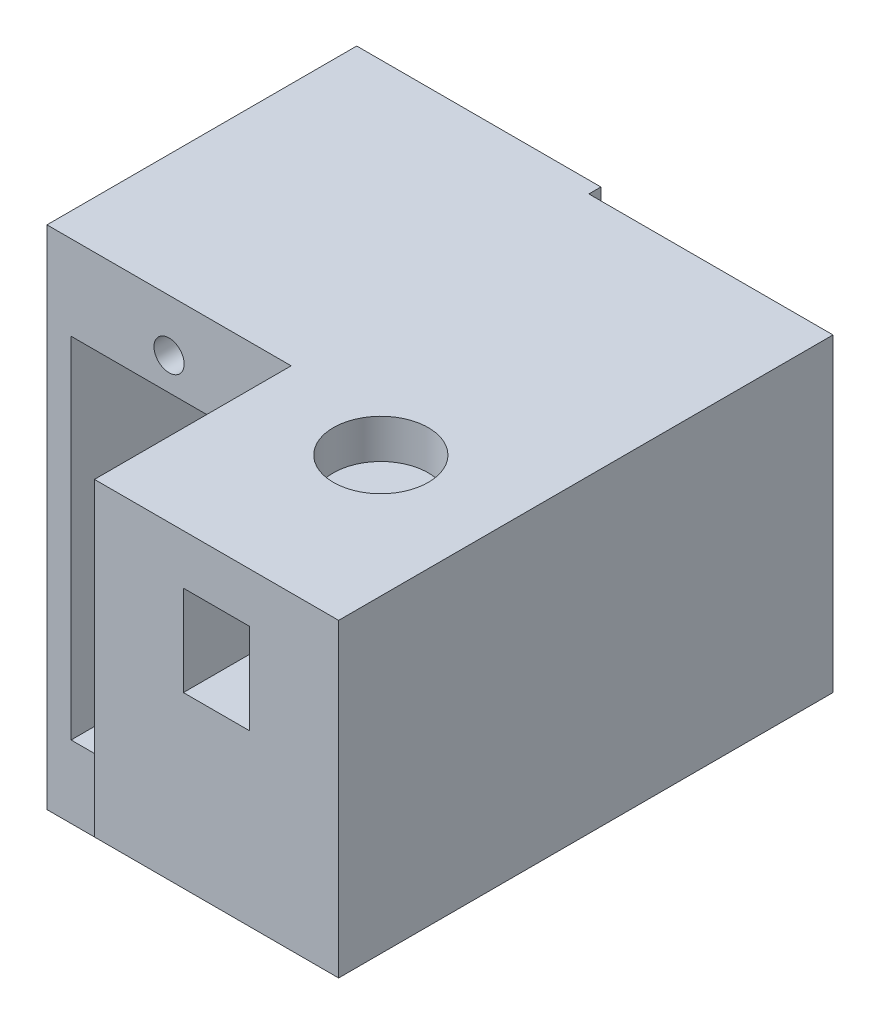
ISO-10303-21;
HEADER;
FILE_DESCRIPTION(('STEP AP214'),'2;1');
FILE_NAME('part.step','',(''),(''),'','','');
FILE_SCHEMA(('AUTOMOTIVE_DESIGN { 1 0 10303 214 1 1 1 1 }'));
ENDSEC;
DATA;
#1=APPLICATION_CONTEXT('core data for automotive mechanical design processes');
#2=APPLICATION_PROTOCOL_DEFINITION('international standard','automotive_design',2000,#1);
#3=PRODUCT_CONTEXT('',#1,'mechanical');
#4=PRODUCT('Part','Part','',(#3));
#5=PRODUCT_RELATED_PRODUCT_CATEGORY('part','',(#4));
#6=PRODUCT_DEFINITION_FORMATION('','',#4);
#7=PRODUCT_DEFINITION_CONTEXT('part definition',#1,'design');
#8=PRODUCT_DEFINITION('design','',#6,#7);
#9=PRODUCT_DEFINITION_SHAPE('','',#8);
#10=(LENGTH_UNIT() NAMED_UNIT(*) SI_UNIT(.MILLI.,.METRE.));
#11=(NAMED_UNIT(*) PLANE_ANGLE_UNIT() SI_UNIT($,.RADIAN.));
#12=(NAMED_UNIT(*) SI_UNIT($,.STERADIAN.) SOLID_ANGLE_UNIT());
#13=UNCERTAINTY_MEASURE_WITH_UNIT(LENGTH_MEASURE(1.E-05),#10,'distance_accuracy_value','');
#14=(GEOMETRIC_REPRESENTATION_CONTEXT(3) GLOBAL_UNCERTAINTY_ASSIGNED_CONTEXT((#13)) GLOBAL_UNIT_ASSIGNED_CONTEXT((#10,
#11,#12)) REPRESENTATION_CONTEXT('',''));
#15=CARTESIAN_POINT('',(0.,0.,0.));
#16=DIRECTION('',(0.,0.,1.));
#17=DIRECTION('',(1.,0.,0.));
#18=AXIS2_PLACEMENT_3D('',#15,#16,#17);
#19=CARTESIAN_POINT('',(-8.1,-6.8,10.9));
#20=DIRECTION('',(1.,0.,0.));
#21=DIRECTION('',(0.,0.,-1.));
#22=AXIS2_PLACEMENT_3D('',#19,#20,#21);
#23=PLANE('',#22);
#24=DIRECTION('',(0.,0.,1.));
#25=VECTOR('',#24,1.);
#26=CARTESIAN_POINT('',(-8.1,-6.8,10.9));
#27=LINE('',#26,#25);
#28=CARTESIAN_POINT('',(-8.1,-6.8,-2.15));
#29=VERTEX_POINT('',#28);
#30=CARTESIAN_POINT('',(-8.1,-6.8,10.9));
#31=VERTEX_POINT('',#30);
#32=EDGE_CURVE('E470',#29,#31,#27,.T.);
#33=ORIENTED_EDGE('',*,*,#32,.F.);
#34=DIRECTION('',(0.,1.,0.));
#35=VECTOR('',#34,1.);
#36=CARTESIAN_POINT('',(-8.1,-40.4,-2.15));
#37=LINE('',#36,#35);
#38=CARTESIAN_POINT('',(-8.1,-27.35,-2.15));
#39=VERTEX_POINT('',#38);
#40=EDGE_CURVE('E11',#39,#29,#37,.T.);
#41=ORIENTED_EDGE('',*,*,#40,.F.);
#42=DIRECTION('',(0.,0.,1.));
#43=VECTOR('',#42,1.);
#44=CARTESIAN_POINT('',(-8.1,-27.35,10.9));
#45=LINE('',#44,#43);
#46=CARTESIAN_POINT('',(-8.1,-27.35,10.9));
#47=VERTEX_POINT('',#46);
#48=EDGE_CURVE('E469',#39,#47,#45,.T.);
#49=ORIENTED_EDGE('',*,*,#48,.T.);
#50=DIRECTION('',(0.,-1.,0.));
#51=VECTOR('',#50,1.);
#52=CARTESIAN_POINT('',(-8.1,-6.8,10.9));
#53=LINE('',#52,#51);
#54=EDGE_CURVE('E42',#31,#47,#53,.T.);
#55=ORIENTED_EDGE('',*,*,#54,.F.);
#56=EDGE_LOOP('',(#33,#41,#49,#55));
#57=FACE_BOUND('',#56,.T.);
#58=ADVANCED_FACE('F39',(#57),#23,.F.);
#59=CARTESIAN_POINT('',(-8.1,-6.8,10.9));
#60=DIRECTION('',(0.,0.,-1.));
#61=DIRECTION('',(-1.,0.,0.));
#62=AXIS2_PLACEMENT_3D('',#59,#60,#61);
#63=PLANE('',#62);
#64=DIRECTION('',(1.,0.,0.));
#65=VECTOR('',#64,1.);
#66=CARTESIAN_POINT('',(-2.2,-16.1,10.9));
#67=LINE('',#66,#65);
#68=CARTESIAN_POINT('',(-2.2,-16.1,10.9));
#69=VERTEX_POINT('',#68);
#70=CARTESIAN_POINT('',(2.2,-16.1,10.9));
#71=VERTEX_POINT('',#70);
#72=EDGE_CURVE('E335',#69,#71,#67,.T.);
#73=ORIENTED_EDGE('',*,*,#72,.F.);
#74=DIRECTION('',(0.,-1.,0.));
#75=VECTOR('',#74,1.);
#76=CARTESIAN_POINT('',(-2.2,-16.1,10.9));
#77=LINE('',#76,#75);
#78=CARTESIAN_POINT('',(-2.2,-10.1,10.9));
#79=VERTEX_POINT('',#78);
#80=EDGE_CURVE('E310',#79,#69,#77,.T.);
#81=ORIENTED_EDGE('',*,*,#80,.F.);
#82=DIRECTION('',(-1.,0.,0.));
#83=VECTOR('',#82,1.);
#84=CARTESIAN_POINT('',(-2.2,-10.1,10.9));
#85=LINE('',#84,#83);
#86=CARTESIAN_POINT('',(2.2,-10.1,10.9));
#87=VERTEX_POINT('',#86);
#88=EDGE_CURVE('E324',#87,#79,#85,.T.);
#89=ORIENTED_EDGE('',*,*,#88,.F.);
#90=DIRECTION('',(0.,1.,0.));
#91=VECTOR('',#90,1.);
#92=CARTESIAN_POINT('',(2.2,-16.1,10.9));
#93=LINE('',#92,#91);
#94=EDGE_CURVE('E339',#71,#87,#93,.T.);
#95=ORIENTED_EDGE('',*,*,#94,.F.);
#96=EDGE_LOOP('',(#73,#81,#89,#95));
#97=FACE_BOUND('',#96,.T.);
#98=DIRECTION('',(1.,0.,0.));
#99=VECTOR('',#98,1.);
#100=CARTESIAN_POINT('',(-8.1,-27.35,10.9));
#101=LINE('',#100,#99);
#102=CARTESIAN_POINT('',(8.1,-27.35,10.9));
#103=VERTEX_POINT('',#102);
#104=EDGE_CURVE('E488',#47,#103,#101,.T.);
#105=ORIENTED_EDGE('',*,*,#104,.T.);
#106=DIRECTION('',(0.,-1.,0.));
#107=VECTOR('',#106,1.);
#108=CARTESIAN_POINT('',(8.1,-6.8,10.9));
#109=LINE('',#108,#107);
#110=CARTESIAN_POINT('',(8.1,-6.8,10.9));
#111=VERTEX_POINT('',#110);
#112=EDGE_CURVE('E502',#111,#103,#109,.T.);
#113=ORIENTED_EDGE('',*,*,#112,.F.);
#114=DIRECTION('',(1.,0.,0.));
#115=VECTOR('',#114,1.);
#116=CARTESIAN_POINT('',(-8.1,-6.8,10.9));
#117=LINE('',#116,#115);
#118=EDGE_CURVE('E473',#31,#111,#117,.T.);
#119=ORIENTED_EDGE('',*,*,#118,.F.);
#120=ORIENTED_EDGE('',*,*,#54,.T.);
#121=EDGE_LOOP('',(#105,#113,#119,#120));
#122=FACE_BOUND('',#121,.T.);
#123=ADVANCED_FACE('F514',(#97,#122),#63,.F.);
#124=CARTESIAN_POINT('',(8.1,-6.8,10.9));
#125=DIRECTION('',(-1.,0.,0.));
#126=DIRECTION('',(0.,0.,1.));
#127=AXIS2_PLACEMENT_3D('',#124,#125,#126);
#128=PLANE('',#127);
#129=DIRECTION('',(0.,0.,-1.));
#130=VECTOR('',#129,1.);
#131=CARTESIAN_POINT('',(8.1,-27.35,10.9));
#132=LINE('',#131,#130);
#133=CARTESIAN_POINT('',(8.1,-27.35,-21.9));
#134=VERTEX_POINT('',#133);
#135=EDGE_CURVE('E491',#103,#134,#132,.T.);
#136=ORIENTED_EDGE('',*,*,#135,.T.);
#137=DIRECTION('',(0.,-1.,0.));
#138=VECTOR('',#137,1.);
#139=CARTESIAN_POINT('',(8.1,-6.8,-21.9));
#140=LINE('',#139,#138);
#141=CARTESIAN_POINT('',(8.1,-6.8,-21.9));
#142=VERTEX_POINT('',#141);
#143=EDGE_CURVE('E499',#142,#134,#140,.T.);
#144=ORIENTED_EDGE('',*,*,#143,.F.);
#145=DIRECTION('',(0.,0.,-1.));
#146=VECTOR('',#145,1.);
#147=CARTESIAN_POINT('',(8.1,-6.8,10.9));
#148=LINE('',#147,#146);
#149=EDGE_CURVE('E477',#111,#142,#148,.T.);
#150=ORIENTED_EDGE('',*,*,#149,.F.);
#151=ORIENTED_EDGE('',*,*,#112,.T.);
#152=EDGE_LOOP('',(#136,#144,#150,#151));
#153=FACE_BOUND('',#152,.T.);
#154=ADVANCED_FACE('F525',(#153),#128,.F.);
#155=CARTESIAN_POINT('',(-8.1,-6.8,-21.9));
#156=DIRECTION('',(0.,0.,1.));
#157=DIRECTION('',(1.,0.,0.));
#158=AXIS2_PLACEMENT_3D('',#155,#156,#157);
#159=PLANE('',#158);
#160=DIRECTION('',(-1.,0.,0.));
#161=VECTOR('',#160,1.);
#162=CARTESIAN_POINT('',(-8.1,-27.35,-21.9));
#163=LINE('',#162,#161);
#164=CARTESIAN_POINT('',(-8.1,-27.35,-21.9));
#165=VERTEX_POINT('',#164);
#166=EDGE_CURVE('E474',#134,#165,#163,.T.);
#167=ORIENTED_EDGE('',*,*,#166,.T.);
#168=DIRECTION('',(0.,-1.,0.));
#169=VECTOR('',#168,1.);
#170=CARTESIAN_POINT('',(-8.1,-6.8,-21.9));
#171=LINE('',#170,#169);
#172=CARTESIAN_POINT('',(-8.1,-6.8,-21.9));
#173=VERTEX_POINT('',#172);
#174=EDGE_CURVE('E483',#173,#165,#171,.T.);
#175=ORIENTED_EDGE('',*,*,#174,.F.);
#176=DIRECTION('',(-1.,0.,0.));
#177=VECTOR('',#176,1.);
#178=CARTESIAN_POINT('',(-8.1,-6.8,-21.9));
#179=LINE('',#178,#177);
#180=EDGE_CURVE('E480',#142,#173,#179,.T.);
#181=ORIENTED_EDGE('',*,*,#180,.F.);
#182=ORIENTED_EDGE('',*,*,#143,.T.);
#183=EDGE_LOOP('',(#167,#175,#181,#182));
#184=FACE_BOUND('',#183,.T.);
#185=ADVANCED_FACE('F528',(#184),#159,.F.);
#186=CARTESIAN_POINT('',(0.,-6.8,0.));
#187=DIRECTION('',(0.,-1.,0.));
#188=DIRECTION('',(0.,0.,-1.));
#189=AXIS2_PLACEMENT_3D('',#186,#187,#188);
#190=PLANE('',#189);
#191=CARTESIAN_POINT('',(0.,-6.8,0.));
#192=DIRECTION('',(0.,1.,0.));
#193=DIRECTION('',(0.,0.,1.));
#194=AXIS2_PLACEMENT_3D('',#191,#192,#193);
#195=CIRCLE('',#194,3.15);
#196=CARTESIAN_POINT('',(0.,-6.8,3.15));
#197=VERTEX_POINT('',#196);
#198=EDGE_CURVE('E349',#197,#197,#195,.T.);
#199=ORIENTED_EDGE('',*,*,#198,.F.);
#200=EDGE_LOOP('',(#199));
#201=FACE_BOUND('',#200,.T.);
#202=ORIENTED_EDGE('',*,*,#180,.T.);
#203=DIRECTION('',(0.,0.,-1.));
#204=VECTOR('',#203,1.);
#205=CARTESIAN_POINT('',(-8.1,-6.8,-2.15));
#206=LINE('',#205,#204);
#207=CARTESIAN_POINT('',(-8.1,-6.8,-22.7));
#208=VERTEX_POINT('',#207);
#209=EDGE_CURVE('E436',#173,#208,#206,.T.);
#210=ORIENTED_EDGE('',*,*,#209,.T.);
#211=DIRECTION('',(-1.,0.,0.));
#212=VECTOR('',#211,1.);
#213=CARTESIAN_POINT('',(-24.3,-6.8,-22.7));
#214=LINE('',#213,#212);
#215=CARTESIAN_POINT('',(-24.3,-6.8,-22.7));
#216=VERTEX_POINT('',#215);
#217=EDGE_CURVE('E440',#208,#216,#214,.T.);
#218=ORIENTED_EDGE('',*,*,#217,.T.);
#219=DIRECTION('',(0.,0.,1.));
#220=VECTOR('',#219,1.);
#221=CARTESIAN_POINT('',(-24.3,-6.8,-2.15));
#222=LINE('',#221,#220);
#223=CARTESIAN_POINT('',(-24.3,-6.8,-2.15));
#224=VERTEX_POINT('',#223);
#225=EDGE_CURVE('E419',#216,#224,#222,.T.);
#226=ORIENTED_EDGE('',*,*,#225,.T.);
#227=DIRECTION('',(1.,0.,0.));
#228=VECTOR('',#227,1.);
#229=CARTESIAN_POINT('',(-24.3,-6.8,-2.15));
#230=LINE('',#229,#228);
#231=EDGE_CURVE('E432',#224,#29,#230,.T.);
#232=ORIENTED_EDGE('',*,*,#231,.T.);
#233=ORIENTED_EDGE('',*,*,#32,.T.);
#234=ORIENTED_EDGE('',*,*,#118,.T.);
#235=ORIENTED_EDGE('',*,*,#149,.T.);
#236=EDGE_LOOP('',(#202,#210,#218,#226,#232,#233,#234,#235));
#237=FACE_BOUND('',#236,.T.);
#238=ADVANCED_FACE('F532',(#201,#237),#190,.F.);
#239=CARTESIAN_POINT('',(0.,-27.35,0.));
#240=DIRECTION('',(0.,-1.,0.));
#241=DIRECTION('',(0.,0.,-1.));
#242=AXIS2_PLACEMENT_3D('',#239,#240,#241);
#243=PLANE('',#242);
#244=CARTESIAN_POINT('',(0.,-27.35,8.25));
#245=DIRECTION('',(0.,1.,0.));
#246=DIRECTION('',(0.,0.,1.));
#247=AXIS2_PLACEMENT_3D('',#244,#245,#246);
#248=CIRCLE('',#247,1.);
#249=CARTESIAN_POINT('',(0.,-27.35,9.25));
#250=VERTEX_POINT('',#249);
#251=EDGE_CURVE('E367',#250,#250,#248,.T.);
#252=ORIENTED_EDGE('',*,*,#251,.T.);
#253=EDGE_LOOP('',(#252));
#254=FACE_BOUND('',#253,.T.);
#255=CARTESIAN_POINT('',(0.,-27.35,-19.25));
#256=DIRECTION('',(0.,1.,0.));
#257=DIRECTION('',(0.,0.,1.));
#258=AXIS2_PLACEMENT_3D('',#255,#256,#257);
#259=CIRCLE('',#258,1.);
#260=CARTESIAN_POINT('',(0.,-27.35,-18.25));
#261=VERTEX_POINT('',#260);
#262=EDGE_CURVE('E375',#261,#261,#259,.T.);
#263=ORIENTED_EDGE('',*,*,#262,.T.);
#264=EDGE_LOOP('',(#263));
#265=FACE_BOUND('',#264,.T.);
#266=DIRECTION('',(0.,0.,1.));
#267=VECTOR('',#266,1.);
#268=CARTESIAN_POINT('',(-6.5,-27.35,6.1));
#269=LINE('',#268,#267);
#270=CARTESIAN_POINT('',(-6.5,-27.35,-17.1));
#271=VERTEX_POINT('',#270);
#272=CARTESIAN_POINT('',(-6.5,-27.35,6.1));
#273=VERTEX_POINT('',#272);
#274=EDGE_CURVE('E383',#271,#273,#269,.T.);
#275=ORIENTED_EDGE('',*,*,#274,.T.);
#276=DIRECTION('',(1.,0.,0.));
#277=VECTOR('',#276,1.);
#278=CARTESIAN_POINT('',(-6.5,-27.35,6.1));
#279=LINE('',#278,#277);
#280=CARTESIAN_POINT('',(6.5,-27.35,6.1));
#281=VERTEX_POINT('',#280);
#282=EDGE_CURVE('E387',#273,#281,#279,.T.);
#283=ORIENTED_EDGE('',*,*,#282,.T.);
#284=DIRECTION('',(0.,0.,-1.));
#285=VECTOR('',#284,1.);
#286=CARTESIAN_POINT('',(6.5,-27.35,6.1));
#287=LINE('',#286,#285);
#288=CARTESIAN_POINT('',(6.5,-27.35,-17.1));
#289=VERTEX_POINT('',#288);
#290=EDGE_CURVE('E392',#281,#289,#287,.T.);
#291=ORIENTED_EDGE('',*,*,#290,.T.);
#292=DIRECTION('',(-1.,0.,0.));
#293=VECTOR('',#292,1.);
#294=CARTESIAN_POINT('',(-6.5,-27.35,-17.1));
#295=LINE('',#294,#293);
#296=EDGE_CURVE('E396',#289,#271,#295,.T.);
#297=ORIENTED_EDGE('',*,*,#296,.T.);
#298=EDGE_LOOP('',(#275,#283,#291,#297));
#299=FACE_BOUND('',#298,.T.);
#300=EDGE_CURVE('E484',#165,#39,#45,.T.);
#301=ORIENTED_EDGE('',*,*,#300,.F.);
#302=ORIENTED_EDGE('',*,*,#166,.F.);
#303=ORIENTED_EDGE('',*,*,#135,.F.);
#304=ORIENTED_EDGE('',*,*,#104,.F.);
#305=ORIENTED_EDGE('',*,*,#48,.F.);
#306=EDGE_LOOP('',(#301,#302,#303,#304,#305));
#307=FACE_BOUND('',#306,.T.);
#308=ADVANCED_FACE('F522',(#254,#265,#299,#307),#243,.T.);
#309=CARTESIAN_POINT('',(-8.1,-40.4,-2.15));
#310=DIRECTION('',(-1.,0.,0.));
#311=DIRECTION('',(0.,0.,1.));
#312=AXIS2_PLACEMENT_3D('',#309,#310,#311);
#313=PLANE('',#312);
#314=DIRECTION('',(0.,1.,0.));
#315=VECTOR('',#314,1.);
#316=CARTESIAN_POINT('',(-8.1,-40.4,-22.7));
#317=LINE('',#316,#315);
#318=CARTESIAN_POINT('',(-8.1,-40.4,-22.7));
#319=VERTEX_POINT('',#318);
#320=EDGE_CURVE('E449',#319,#208,#317,.T.);
#321=ORIENTED_EDGE('',*,*,#320,.T.);
#322=ORIENTED_EDGE('',*,*,#209,.F.);
#323=ORIENTED_EDGE('',*,*,#174,.T.);
#324=ORIENTED_EDGE('',*,*,#300,.T.);
#325=CARTESIAN_POINT('',(-8.1,-40.4,-2.15));
#326=VERTEX_POINT('',#325);
#327=EDGE_CURVE('E49',#326,#39,#37,.T.);
#328=ORIENTED_EDGE('',*,*,#327,.F.);
#329=DIRECTION('',(0.,0.,-1.));
#330=VECTOR('',#329,1.);
#331=CARTESIAN_POINT('',(-8.1,-40.4,-2.15));
#332=LINE('',#331,#330);
#333=EDGE_CURVE('E454',#326,#319,#332,.T.);
#334=ORIENTED_EDGE('',*,*,#333,.T.);
#335=EDGE_LOOP('',(#321,#322,#323,#324,#328,#334));
#336=FACE_BOUND('',#335,.T.);
#337=ADVANCED_FACE('F542',(#336),#313,.F.);
#338=CARTESIAN_POINT('',(-24.3,-40.4,-2.15));
#339=DIRECTION('',(1.,0.,0.));
#340=DIRECTION('',(0.,0.,-1.));
#341=AXIS2_PLACEMENT_3D('',#338,#339,#340);
#342=PLANE('',#341);
#343=DIRECTION('',(0.,0.,-1.));
#344=VECTOR('',#343,1.);
#345=CARTESIAN_POINT('',(-24.3,-40.4,-2.15));
#346=LINE('',#345,#344);
#347=CARTESIAN_POINT('',(-24.3,-40.4,-2.15));
#348=VERTEX_POINT('',#347);
#349=CARTESIAN_POINT('',(-24.3,-40.4,-22.7));
#350=VERTEX_POINT('',#349);
#351=EDGE_CURVE('E465',#348,#350,#346,.T.);
#352=ORIENTED_EDGE('',*,*,#351,.F.);
#353=DIRECTION('',(0.,-1.,0.));
#354=VECTOR('',#353,1.);
#355=CARTESIAN_POINT('',(-24.3,-40.4,-2.15));
#356=LINE('',#355,#354);
#357=EDGE_CURVE('E445',#224,#348,#356,.T.);
#358=ORIENTED_EDGE('',*,*,#357,.F.);
#359=ORIENTED_EDGE('',*,*,#225,.F.);
#360=DIRECTION('',(0.,-1.,0.));
#361=VECTOR('',#360,1.);
#362=CARTESIAN_POINT('',(-24.3,-40.4,-22.7));
#363=LINE('',#362,#361);
#364=EDGE_CURVE('E444',#216,#350,#363,.T.);
#365=ORIENTED_EDGE('',*,*,#364,.T.);
#366=EDGE_LOOP('',(#352,#358,#359,#365));
#367=FACE_BOUND('',#366,.T.);
#368=ADVANCED_FACE('F549',(#367),#342,.F.);
#369=CARTESIAN_POINT('',(-24.3,-40.4,-2.15));
#370=DIRECTION('',(0.,1.,0.));
#371=DIRECTION('',(0.,0.,1.));
#372=AXIS2_PLACEMENT_3D('',#369,#370,#371);
#373=PLANE('',#372);
#374=DIRECTION('',(1.,0.,0.));
#375=VECTOR('',#374,1.);
#376=CARTESIAN_POINT('',(-24.3,-40.4,-22.7));
#377=LINE('',#376,#375);
#378=EDGE_CURVE('E457',#350,#319,#377,.T.);
#379=ORIENTED_EDGE('',*,*,#378,.T.);
#380=ORIENTED_EDGE('',*,*,#333,.F.);
#381=DIRECTION('',(1.,0.,0.));
#382=VECTOR('',#381,1.);
#383=CARTESIAN_POINT('',(-24.3,-40.4,-2.15));
#384=LINE('',#383,#382);
#385=EDGE_CURVE('E448',#348,#326,#384,.T.);
#386=ORIENTED_EDGE('',*,*,#385,.F.);
#387=ORIENTED_EDGE('',*,*,#351,.T.);
#388=EDGE_LOOP('',(#379,#380,#386,#387));
#389=FACE_BOUND('',#388,.T.);
#390=ADVANCED_FACE('F551',(#389),#373,.F.);
#391=CARTESIAN_POINT('',(0.,0.,-2.15));
#392=DIRECTION('',(0.,0.,-1.));
#393=DIRECTION('',(-1.,0.,0.));
#394=AXIS2_PLACEMENT_3D('',#391,#392,#393);
#395=PLANE('',#394);
#396=CARTESIAN_POINT('',(-16.2,-10.25,-2.15));
#397=DIRECTION('',(0.,0.,1.));
#398=DIRECTION('',(1.,0.,0.));
#399=AXIS2_PLACEMENT_3D('',#396,#397,#398);
#400=CIRCLE('',#399,1.);
#401=CARTESIAN_POINT('',(-15.2,-10.25,-2.15));
#402=VERTEX_POINT('',#401);
#403=EDGE_CURVE('E257',#402,#402,#400,.T.);
#404=ORIENTED_EDGE('',*,*,#403,.F.);
#405=EDGE_LOOP('',(#404));
#406=FACE_BOUND('',#405,.T.);
#407=CARTESIAN_POINT('',(-16.2,-37.75,-2.15));
#408=DIRECTION('',(0.,0.,1.));
#409=DIRECTION('',(1.,0.,0.));
#410=AXIS2_PLACEMENT_3D('',#407,#408,#409);
#411=CIRCLE('',#410,1.);
#412=CARTESIAN_POINT('',(-15.2,-37.75,-2.15));
#413=VERTEX_POINT('',#412);
#414=EDGE_CURVE('E265',#413,#413,#411,.T.);
#415=ORIENTED_EDGE('',*,*,#414,.F.);
#416=EDGE_LOOP('',(#415));
#417=FACE_BOUND('',#416,.T.);
#418=DIRECTION('',(1.,0.,0.));
#419=VECTOR('',#418,1.);
#420=CARTESIAN_POINT('',(-22.7,-35.6,-2.15));
#421=LINE('',#420,#419);
#422=CARTESIAN_POINT('',(-22.7,-35.6,-2.15));
#423=VERTEX_POINT('',#422);
#424=CARTESIAN_POINT('',(-9.7,-35.6,-2.15));
#425=VERTEX_POINT('',#424);
#426=EDGE_CURVE('E296',#423,#425,#421,.T.);
#427=ORIENTED_EDGE('',*,*,#426,.F.);
#428=DIRECTION('',(0.,-1.,0.));
#429=VECTOR('',#428,1.);
#430=CARTESIAN_POINT('',(-22.7,-35.6,-2.15));
#431=LINE('',#430,#429);
#432=CARTESIAN_POINT('',(-22.7,-12.4,-2.15));
#433=VERTEX_POINT('',#432);
#434=EDGE_CURVE('E64',#433,#423,#431,.T.);
#435=ORIENTED_EDGE('',*,*,#434,.F.);
#436=DIRECTION('',(-1.,0.,0.));
#437=VECTOR('',#436,1.);
#438=CARTESIAN_POINT('',(-22.7,-12.4,-2.15));
#439=LINE('',#438,#437);
#440=CARTESIAN_POINT('',(-9.7,-12.4,-2.15));
#441=VERTEX_POINT('',#440);
#442=EDGE_CURVE('E281',#441,#433,#439,.T.);
#443=ORIENTED_EDGE('',*,*,#442,.F.);
#444=DIRECTION('',(0.,1.,0.));
#445=VECTOR('',#444,1.);
#446=CARTESIAN_POINT('',(-9.7,-35.6,-2.15));
#447=LINE('',#446,#445);
#448=EDGE_CURVE('E300',#425,#441,#447,.T.);
#449=ORIENTED_EDGE('',*,*,#448,.F.);
#450=EDGE_LOOP('',(#427,#435,#443,#449));
#451=FACE_BOUND('',#450,.T.);
#452=ORIENTED_EDGE('',*,*,#40,.T.);
#453=ORIENTED_EDGE('',*,*,#231,.F.);
#454=ORIENTED_EDGE('',*,*,#357,.T.);
#455=ORIENTED_EDGE('',*,*,#385,.T.);
#456=ORIENTED_EDGE('',*,*,#327,.T.);
#457=EDGE_LOOP('',(#452,#453,#454,#455,#456));
#458=FACE_BOUND('',#457,.T.);
#459=ADVANCED_FACE('F537',(#406,#417,#451,#458),#395,.F.);
#460=CARTESIAN_POINT('',(0.,0.,-22.7));
#461=DIRECTION('',(0.,0.,-1.));
#462=DIRECTION('',(-1.,0.,0.));
#463=AXIS2_PLACEMENT_3D('',#460,#461,#462);
#464=PLANE('',#463);
#465=CARTESIAN_POINT('',(-16.2,-18.5,-22.7));
#466=DIRECTION('',(0.,0.,1.));
#467=DIRECTION('',(1.,0.,0.));
#468=AXIS2_PLACEMENT_3D('',#465,#466,#467);
#469=CIRCLE('',#468,3.15);
#470=CARTESIAN_POINT('',(-13.05,-18.5,-22.7));
#471=VERTEX_POINT('',#470);
#472=EDGE_CURVE('E253',#471,#471,#469,.T.);
#473=ORIENTED_EDGE('',*,*,#472,.T.);
#474=EDGE_LOOP('',(#473));
#475=FACE_BOUND('',#474,.T.);
#476=ORIENTED_EDGE('',*,*,#378,.F.);
#477=ORIENTED_EDGE('',*,*,#364,.F.);
#478=ORIENTED_EDGE('',*,*,#217,.F.);
#479=ORIENTED_EDGE('',*,*,#320,.F.);
#480=EDGE_LOOP('',(#476,#477,#478,#479));
#481=FACE_BOUND('',#480,.T.);
#482=ADVANCED_FACE('F546',(#475,#481),#464,.T.);
#483=CARTESIAN_POINT('',(-6.5,-27.35,6.1));
#484=DIRECTION('',(-1.,0.,0.));
#485=DIRECTION('',(0.,0.,1.));
#486=AXIS2_PLACEMENT_3D('',#483,#484,#485);
#487=PLANE('',#486);
#488=DIRECTION('',(0.,0.,1.));
#489=VECTOR('',#488,1.);
#490=CARTESIAN_POINT('',(-6.5,-10.1,6.1));
#491=LINE('',#490,#489);
#492=CARTESIAN_POINT('',(-6.5,-10.1,-17.1));
#493=VERTEX_POINT('',#492);
#494=CARTESIAN_POINT('',(-6.5,-10.1,6.1));
#495=VERTEX_POINT('',#494);
#496=EDGE_CURVE('E379',#493,#495,#491,.T.);
#497=ORIENTED_EDGE('',*,*,#496,.T.);
#498=DIRECTION('',(0.,1.,0.));
#499=VECTOR('',#498,1.);
#500=CARTESIAN_POINT('',(-6.5,-27.35,6.1));
#501=LINE('',#500,#499);
#502=EDGE_CURVE('E400',#273,#495,#501,.T.);
#503=ORIENTED_EDGE('',*,*,#502,.F.);
#504=ORIENTED_EDGE('',*,*,#274,.F.);
#505=DIRECTION('',(0.,1.,0.));
#506=VECTOR('',#505,1.);
#507=CARTESIAN_POINT('',(-6.5,-27.35,-17.1));
#508=LINE('',#507,#506);
#509=EDGE_CURVE('E416',#271,#493,#508,.T.);
#510=ORIENTED_EDGE('',*,*,#509,.T.);
#511=EDGE_LOOP('',(#497,#503,#504,#510));
#512=FACE_BOUND('',#511,.T.);
#513=ADVANCED_FACE('F623',(#512),#487,.F.);
#514=CARTESIAN_POINT('',(-6.5,-27.35,-17.1));
#515=DIRECTION('',(0.,0.,-1.));
#516=DIRECTION('',(-1.,0.,0.));
#517=AXIS2_PLACEMENT_3D('',#514,#515,#516);
#518=PLANE('',#517);
#519=DIRECTION('',(-1.,0.,0.));
#520=VECTOR('',#519,1.);
#521=CARTESIAN_POINT('',(-6.5,-10.1,-17.1));
#522=LINE('',#521,#520);
#523=CARTESIAN_POINT('',(6.5,-10.1,-17.1));
#524=VERTEX_POINT('',#523);
#525=EDGE_CURVE('E388',#524,#493,#522,.T.);
#526=ORIENTED_EDGE('',*,*,#525,.T.);
#527=ORIENTED_EDGE('',*,*,#509,.F.);
#528=ORIENTED_EDGE('',*,*,#296,.F.);
#529=DIRECTION('',(0.,1.,0.));
#530=VECTOR('',#529,1.);
#531=CARTESIAN_POINT('',(6.5,-27.35,-17.1));
#532=LINE('',#531,#530);
#533=EDGE_CURVE('E420',#289,#524,#532,.T.);
#534=ORIENTED_EDGE('',*,*,#533,.T.);
#535=EDGE_LOOP('',(#526,#527,#528,#534));
#536=FACE_BOUND('',#535,.T.);
#537=ADVANCED_FACE('F619',(#536),#518,.F.);
#538=CARTESIAN_POINT('',(6.5,-27.35,6.1));
#539=DIRECTION('',(1.,0.,0.));
#540=DIRECTION('',(0.,0.,-1.));
#541=AXIS2_PLACEMENT_3D('',#538,#539,#540);
#542=PLANE('',#541);
#543=DIRECTION('',(0.,0.,-1.));
#544=VECTOR('',#543,1.);
#545=CARTESIAN_POINT('',(6.5,-10.1,6.1));
#546=LINE('',#545,#544);
#547=CARTESIAN_POINT('',(6.5,-10.1,6.1));
#548=VERTEX_POINT('',#547);
#549=EDGE_CURVE('E409',#548,#524,#546,.T.);
#550=ORIENTED_EDGE('',*,*,#549,.T.);
#551=ORIENTED_EDGE('',*,*,#533,.F.);
#552=ORIENTED_EDGE('',*,*,#290,.F.);
#553=DIRECTION('',(0.,1.,0.));
#554=VECTOR('',#553,1.);
#555=CARTESIAN_POINT('',(6.5,-27.35,6.1));
#556=LINE('',#555,#554);
#557=EDGE_CURVE('E423',#281,#548,#556,.T.);
#558=ORIENTED_EDGE('',*,*,#557,.T.);
#559=EDGE_LOOP('',(#550,#551,#552,#558));
#560=FACE_BOUND('',#559,.T.);
#561=ADVANCED_FACE('F622',(#560),#542,.F.);
#562=CARTESIAN_POINT('',(-6.5,-27.35,6.1));
#563=DIRECTION('',(0.,0.,1.));
#564=DIRECTION('',(1.,0.,0.));
#565=AXIS2_PLACEMENT_3D('',#562,#563,#564);
#566=PLANE('',#565);
#567=DIRECTION('',(1.,0.,0.));
#568=VECTOR('',#567,1.);
#569=CARTESIAN_POINT('',(-6.5,-10.1,6.1));
#570=LINE('',#569,#568);
#571=CARTESIAN_POINT('',(-2.2,-10.1,6.1));
#572=VERTEX_POINT('',#571);
#573=EDGE_CURVE('E405',#495,#572,#570,.T.);
#574=ORIENTED_EDGE('',*,*,#573,.T.);
#575=DIRECTION('',(0.,-1.,0.));
#576=VECTOR('',#575,1.);
#577=CARTESIAN_POINT('',(-2.2,-16.1,6.1));
#578=LINE('',#577,#576);
#579=CARTESIAN_POINT('',(-2.2,-16.1,6.1));
#580=VERTEX_POINT('',#579);
#581=EDGE_CURVE('E319',#572,#580,#578,.T.);
#582=ORIENTED_EDGE('',*,*,#581,.T.);
#583=DIRECTION('',(1.,0.,0.));
#584=VECTOR('',#583,1.);
#585=CARTESIAN_POINT('',(-2.2,-16.1,6.1));
#586=LINE('',#585,#584);
#587=CARTESIAN_POINT('',(2.2,-16.1,6.1));
#588=VERTEX_POINT('',#587);
#589=EDGE_CURVE('E323',#580,#588,#586,.T.);
#590=ORIENTED_EDGE('',*,*,#589,.T.);
#591=DIRECTION('',(0.,1.,0.));
#592=VECTOR('',#591,1.);
#593=CARTESIAN_POINT('',(2.2,-16.1,6.1));
#594=LINE('',#593,#592);
#595=CARTESIAN_POINT('',(2.2,-10.1,6.1));
#596=VERTEX_POINT('',#595);
#597=EDGE_CURVE('E328',#588,#596,#594,.T.);
#598=ORIENTED_EDGE('',*,*,#597,.T.);
#599=EDGE_CURVE('E404',#596,#548,#570,.T.);
#600=ORIENTED_EDGE('',*,*,#599,.T.);
#601=ORIENTED_EDGE('',*,*,#557,.F.);
#602=ORIENTED_EDGE('',*,*,#282,.F.);
#603=ORIENTED_EDGE('',*,*,#502,.T.);
#604=EDGE_LOOP('',(#574,#582,#590,#598,#600,#601,#602,#603));
#605=FACE_BOUND('',#604,.T.);
#606=ADVANCED_FACE('F617',(#605),#566,.F.);
#607=CARTESIAN_POINT('',(0.,-10.1,0.));
#608=DIRECTION('',(0.,-1.,0.));
#609=DIRECTION('',(0.,0.,-1.));
#610=AXIS2_PLACEMENT_3D('',#607,#608,#609);
#611=PLANE('',#610);
#612=ORIENTED_EDGE('',*,*,#496,.F.);
#613=ORIENTED_EDGE('',*,*,#525,.F.);
#614=ORIENTED_EDGE('',*,*,#549,.F.);
#615=ORIENTED_EDGE('',*,*,#599,.F.);
#616=DIRECTION('',(0.,0.,1.));
#617=VECTOR('',#616,1.);
#618=CARTESIAN_POINT('',(2.2,-10.1,6.1));
#619=LINE('',#618,#617);
#620=EDGE_CURVE('E350',#596,#87,#619,.T.);
#621=ORIENTED_EDGE('',*,*,#620,.T.);
#622=ORIENTED_EDGE('',*,*,#88,.T.);
#623=DIRECTION('',(0.,0.,1.));
#624=VECTOR('',#623,1.);
#625=CARTESIAN_POINT('',(-2.2,-10.1,6.1));
#626=LINE('',#625,#624);
#627=EDGE_CURVE('E346',#572,#79,#626,.T.);
#628=ORIENTED_EDGE('',*,*,#627,.F.);
#629=ORIENTED_EDGE('',*,*,#573,.F.);
#630=EDGE_LOOP('',(#612,#613,#614,#615,#621,#622,#628,#629));
#631=FACE_BOUND('',#630,.T.);
#632=ADVANCED_FACE('F613',(#631),#611,.T.);
#633=CARTESIAN_POINT('',(0.,-27.35,-19.25));
#634=DIRECTION('',(0.,1.,0.));
#635=DIRECTION('',(0.,0.,1.));
#636=AXIS2_PLACEMENT_3D('',#633,#634,#635);
#637=CYLINDRICAL_SURFACE('',#636,1.);
#638=ORIENTED_EDGE('',*,*,#262,.F.);
#639=EDGE_LOOP('',(#638));
#640=FACE_BOUND('',#639,.T.);
#641=CARTESIAN_POINT('',(0.,-21.35,-19.25));
#642=DIRECTION('',(0.,1.,0.));
#643=DIRECTION('',(0.,0.,1.));
#644=AXIS2_PLACEMENT_3D('',#641,#642,#643);
#645=CIRCLE('',#644,1.);
#646=CARTESIAN_POINT('',(0.,-21.35,-18.25));
#647=VERTEX_POINT('',#646);
#648=EDGE_CURVE('E371',#647,#647,#645,.T.);
#649=ORIENTED_EDGE('',*,*,#648,.T.);
#650=EDGE_LOOP('',(#649));
#651=FACE_BOUND('',#650,.T.);
#652=ADVANCED_FACE('F609',(#640,#651),#637,.F.);
#653=CARTESIAN_POINT('',(0.,-21.35,-19.25));
#654=DIRECTION('',(0.,1.,0.));
#655=DIRECTION('',(0.,0.,1.));
#656=AXIS2_PLACEMENT_3D('',#653,#654,#655);
#657=PLANE('',#656);
#658=ORIENTED_EDGE('',*,*,#648,.F.);
#659=EDGE_LOOP('',(#658));
#660=FACE_BOUND('',#659,.T.);
#661=ADVANCED_FACE('F605',(#660),#657,.F.);
#662=CARTESIAN_POINT('',(0.,-27.35,8.25));
#663=DIRECTION('',(0.,1.,0.));
#664=DIRECTION('',(0.,0.,1.));
#665=AXIS2_PLACEMENT_3D('',#662,#663,#664);
#666=CYLINDRICAL_SURFACE('',#665,1.);
#667=ORIENTED_EDGE('',*,*,#251,.F.);
#668=EDGE_LOOP('',(#667));
#669=FACE_BOUND('',#668,.T.);
#670=CARTESIAN_POINT('',(0.,-21.35,8.25));
#671=DIRECTION('',(0.,1.,0.));
#672=DIRECTION('',(0.,0.,1.));
#673=AXIS2_PLACEMENT_3D('',#670,#671,#672);
#674=CIRCLE('',#673,1.);
#675=CARTESIAN_POINT('',(0.,-21.35,9.25));
#676=VERTEX_POINT('',#675);
#677=EDGE_CURVE('E363',#676,#676,#674,.T.);
#678=ORIENTED_EDGE('',*,*,#677,.T.);
#679=EDGE_LOOP('',(#678));
#680=FACE_BOUND('',#679,.T.);
#681=ADVANCED_FACE('F597',(#669,#680),#666,.F.);
#682=CARTESIAN_POINT('',(0.,-21.35,8.25));
#683=DIRECTION('',(0.,1.,0.));
#684=DIRECTION('',(0.,0.,1.));
#685=AXIS2_PLACEMENT_3D('',#682,#683,#684);
#686=PLANE('',#685);
#687=ORIENTED_EDGE('',*,*,#677,.F.);
#688=EDGE_LOOP('',(#687));
#689=FACE_BOUND('',#688,.T.);
#690=ADVANCED_FACE('F587',(#689),#686,.F.);
#691=CARTESIAN_POINT('',(0.,-9.4,0.));
#692=DIRECTION('',(0.,1.,0.));
#693=DIRECTION('',(0.,0.,1.));
#694=AXIS2_PLACEMENT_3D('',#691,#692,#693);
#695=CYLINDRICAL_SURFACE('',#694,3.15);
#696=CARTESIAN_POINT('',(0.,-9.4,0.));
#697=DIRECTION('',(0.,1.,0.));
#698=DIRECTION('',(0.,0.,1.));
#699=AXIS2_PLACEMENT_3D('',#696,#697,#698);
#700=CIRCLE('',#699,3.15);
#701=CARTESIAN_POINT('',(0.,-9.4,3.15));
#702=VERTEX_POINT('',#701);
#703=EDGE_CURVE('E359',#702,#702,#700,.T.);
#704=ORIENTED_EDGE('',*,*,#703,.F.);
#705=EDGE_LOOP('',(#704));
#706=FACE_BOUND('',#705,.T.);
#707=ORIENTED_EDGE('',*,*,#198,.T.);
#708=EDGE_LOOP('',(#707));
#709=FACE_BOUND('',#708,.T.);
#710=ADVANCED_FACE('F584',(#706,#709),#695,.F.);
#711=CARTESIAN_POINT('',(0.,-9.4,0.));
#712=DIRECTION('',(0.,1.,0.));
#713=DIRECTION('',(0.,0.,1.));
#714=AXIS2_PLACEMENT_3D('',#711,#712,#713);
#715=PLANE('',#714);
#716=ORIENTED_EDGE('',*,*,#703,.T.);
#717=EDGE_LOOP('',(#716));
#718=FACE_BOUND('',#717,.T.);
#719=ADVANCED_FACE('F586',(#718),#715,.T.);
#720=CARTESIAN_POINT('',(-2.2,-16.1,6.1));
#721=DIRECTION('',(-1.,0.,0.));
#722=DIRECTION('',(0.,0.,1.));
#723=AXIS2_PLACEMENT_3D('',#720,#721,#722);
#724=PLANE('',#723);
#725=ORIENTED_EDGE('',*,*,#80,.T.);
#726=DIRECTION('',(0.,0.,1.));
#727=VECTOR('',#726,1.);
#728=CARTESIAN_POINT('',(-2.2,-16.1,6.1));
#729=LINE('',#728,#727);
#730=EDGE_CURVE('E332',#580,#69,#729,.T.);
#731=ORIENTED_EDGE('',*,*,#730,.F.);
#732=ORIENTED_EDGE('',*,*,#581,.F.);
#733=ORIENTED_EDGE('',*,*,#627,.T.);
#734=EDGE_LOOP('',(#725,#731,#732,#733));
#735=FACE_BOUND('',#734,.T.);
#736=ADVANCED_FACE('F594',(#735),#724,.F.);
#737=CARTESIAN_POINT('',(2.2,-16.1,6.1));
#738=DIRECTION('',(1.,0.,0.));
#739=DIRECTION('',(0.,0.,-1.));
#740=AXIS2_PLACEMENT_3D('',#737,#738,#739);
#741=PLANE('',#740);
#742=ORIENTED_EDGE('',*,*,#94,.T.);
#743=ORIENTED_EDGE('',*,*,#620,.F.);
#744=ORIENTED_EDGE('',*,*,#597,.F.);
#745=DIRECTION('',(0.,0.,1.));
#746=VECTOR('',#745,1.);
#747=CARTESIAN_POINT('',(2.2,-16.1,6.1));
#748=LINE('',#747,#746);
#749=EDGE_CURVE('E353',#588,#71,#748,.T.);
#750=ORIENTED_EDGE('',*,*,#749,.T.);
#751=EDGE_LOOP('',(#742,#743,#744,#750));
#752=FACE_BOUND('',#751,.T.);
#753=ADVANCED_FACE('F739',(#752),#741,.F.);
#754=CARTESIAN_POINT('',(-2.2,-16.1,6.1));
#755=DIRECTION('',(0.,-1.,0.));
#756=DIRECTION('',(0.,0.,-1.));
#757=AXIS2_PLACEMENT_3D('',#754,#755,#756);
#758=PLANE('',#757);
#759=ORIENTED_EDGE('',*,*,#72,.T.);
#760=ORIENTED_EDGE('',*,*,#749,.F.);
#761=ORIENTED_EDGE('',*,*,#589,.F.);
#762=ORIENTED_EDGE('',*,*,#730,.T.);
#763=EDGE_LOOP('',(#759,#760,#761,#762));
#764=FACE_BOUND('',#763,.T.);
#765=ADVANCED_FACE('F748',(#764),#758,.F.);
#766=CARTESIAN_POINT('',(-22.7,-35.6,-19.4));
#767=DIRECTION('',(-1.,0.,0.));
#768=DIRECTION('',(0.,0.,1.));
#769=AXIS2_PLACEMENT_3D('',#766,#767,#768);
#770=PLANE('',#769);
#771=ORIENTED_EDGE('',*,*,#434,.T.);
#772=DIRECTION('',(0.,0.,1.));
#773=VECTOR('',#772,1.);
#774=CARTESIAN_POINT('',(-22.7,-35.6,-19.4));
#775=LINE('',#774,#773);
#776=CARTESIAN_POINT('',(-22.7,-35.6,-19.4));
#777=VERTEX_POINT('',#776);
#778=EDGE_CURVE('E293',#777,#423,#775,.T.);
#779=ORIENTED_EDGE('',*,*,#778,.F.);
#780=DIRECTION('',(0.,-1.,0.));
#781=VECTOR('',#780,1.);
#782=CARTESIAN_POINT('',(-22.7,-35.6,-19.4));
#783=LINE('',#782,#781);
#784=CARTESIAN_POINT('',(-22.7,-12.4,-19.4));
#785=VERTEX_POINT('',#784);
#786=EDGE_CURVE('E276',#785,#777,#783,.T.);
#787=ORIENTED_EDGE('',*,*,#786,.F.);
#788=DIRECTION('',(0.,0.,1.));
#789=VECTOR('',#788,1.);
#790=CARTESIAN_POINT('',(-22.7,-12.4,-19.4));
#791=LINE('',#790,#789);
#792=EDGE_CURVE('E307',#785,#433,#791,.T.);
#793=ORIENTED_EDGE('',*,*,#792,.T.);
#794=EDGE_LOOP('',(#771,#779,#787,#793));
#795=FACE_BOUND('',#794,.T.);
#796=ADVANCED_FACE('F758',(#795),#770,.F.);
#797=CARTESIAN_POINT('',(-22.7,-12.4,-19.4));
#798=DIRECTION('',(0.,1.,0.));
#799=DIRECTION('',(0.,0.,1.));
#800=AXIS2_PLACEMENT_3D('',#797,#798,#799);
#801=PLANE('',#800);
#802=DIRECTION('',(-1.,0.,0.));
#803=VECTOR('',#802,1.);
#804=CARTESIAN_POINT('',(-22.7,-12.4,-19.4));
#805=LINE('',#804,#803);
#806=CARTESIAN_POINT('',(-18.4,-12.4,-19.4));
#807=VERTEX_POINT('',#806);
#808=EDGE_CURVE('E225',#807,#785,#805,.T.);
#809=ORIENTED_EDGE('',*,*,#808,.F.);
#810=DIRECTION('',(0.,0.,1.));
#811=VECTOR('',#810,1.);
#812=CARTESIAN_POINT('',(-18.4,-12.4,-13.4));
#813=LINE('',#812,#811);
#814=CARTESIAN_POINT('',(-18.4,-12.4,-13.4));
#815=VERTEX_POINT('',#814);
#816=EDGE_CURVE('E56',#807,#815,#813,.T.);
#817=ORIENTED_EDGE('',*,*,#816,.T.);
#818=DIRECTION('',(1.,0.,0.));
#819=VECTOR('',#818,1.);
#820=CARTESIAN_POINT('',(-18.4,-12.4,-13.4));
#821=LINE('',#820,#819);
#822=CARTESIAN_POINT('',(-14.,-12.4,-13.4));
#823=VERTEX_POINT('',#822);
#824=EDGE_CURVE('E215',#815,#823,#821,.T.);
#825=ORIENTED_EDGE('',*,*,#824,.T.);
#826=DIRECTION('',(0.,0.,-1.));
#827=VECTOR('',#826,1.);
#828=CARTESIAN_POINT('',(-14.,-12.4,-13.4));
#829=LINE('',#828,#827);
#830=CARTESIAN_POINT('',(-14.,-12.4,-19.4));
#831=VERTEX_POINT('',#830);
#832=EDGE_CURVE('E212',#823,#831,#829,.T.);
#833=ORIENTED_EDGE('',*,*,#832,.T.);
#834=CARTESIAN_POINT('',(-9.7,-12.4,-19.4));
#835=VERTEX_POINT('',#834);
#836=EDGE_CURVE('E289',#835,#831,#805,.T.);
#837=ORIENTED_EDGE('',*,*,#836,.F.);
#838=DIRECTION('',(0.,0.,1.));
#839=VECTOR('',#838,1.);
#840=CARTESIAN_POINT('',(-9.7,-12.4,-19.4));
#841=LINE('',#840,#839);
#842=EDGE_CURVE('E311',#835,#441,#841,.T.);
#843=ORIENTED_EDGE('',*,*,#842,.T.);
#844=ORIENTED_EDGE('',*,*,#442,.T.);
#845=ORIENTED_EDGE('',*,*,#792,.F.);
#846=EDGE_LOOP('',(#809,#817,#825,#833,#837,#843,#844,#845));
#847=FACE_BOUND('',#846,.T.);
#848=ADVANCED_FACE('F223',(#847),#801,.F.);
#849=CARTESIAN_POINT('',(-9.7,-35.6,-19.4));
#850=DIRECTION('',(1.,0.,0.));
#851=DIRECTION('',(0.,0.,-1.));
#852=AXIS2_PLACEMENT_3D('',#849,#850,#851);
#853=PLANE('',#852);
#854=ORIENTED_EDGE('',*,*,#448,.T.);
#855=ORIENTED_EDGE('',*,*,#842,.F.);
#856=DIRECTION('',(0.,1.,0.));
#857=VECTOR('',#856,1.);
#858=CARTESIAN_POINT('',(-9.7,-35.6,-19.4));
#859=LINE('',#858,#857);
#860=CARTESIAN_POINT('',(-9.7,-35.6,-19.4));
#861=VERTEX_POINT('',#860);
#862=EDGE_CURVE('E285',#861,#835,#859,.T.);
#863=ORIENTED_EDGE('',*,*,#862,.F.);
#864=DIRECTION('',(0.,0.,1.));
#865=VECTOR('',#864,1.);
#866=CARTESIAN_POINT('',(-9.7,-35.6,-19.4));
#867=LINE('',#866,#865);
#868=EDGE_CURVE('E314',#861,#425,#867,.T.);
#869=ORIENTED_EDGE('',*,*,#868,.T.);
#870=EDGE_LOOP('',(#854,#855,#863,#869));
#871=FACE_BOUND('',#870,.T.);
#872=ADVANCED_FACE('F774',(#871),#853,.F.);
#873=CARTESIAN_POINT('',(-22.7,-35.6,-19.4));
#874=DIRECTION('',(0.,-1.,0.));
#875=DIRECTION('',(0.,0.,-1.));
#876=AXIS2_PLACEMENT_3D('',#873,#874,#875);
#877=PLANE('',#876);
#878=ORIENTED_EDGE('',*,*,#426,.T.);
#879=ORIENTED_EDGE('',*,*,#868,.F.);
#880=DIRECTION('',(1.,0.,0.));
#881=VECTOR('',#880,1.);
#882=CARTESIAN_POINT('',(-22.7,-35.6,-19.4));
#883=LINE('',#882,#881);
#884=EDGE_CURVE('E280',#777,#861,#883,.T.);
#885=ORIENTED_EDGE('',*,*,#884,.F.);
#886=ORIENTED_EDGE('',*,*,#778,.T.);
#887=EDGE_LOOP('',(#878,#879,#885,#886));
#888=FACE_BOUND('',#887,.T.);
#889=ADVANCED_FACE('F779',(#888),#877,.F.);
#890=CARTESIAN_POINT('',(0.,0.,-19.4));
#891=DIRECTION('',(0.,0.,-1.));
#892=DIRECTION('',(-1.,0.,0.));
#893=AXIS2_PLACEMENT_3D('',#890,#891,#892);
#894=PLANE('',#893);
#895=ORIENTED_EDGE('',*,*,#786,.T.);
#896=ORIENTED_EDGE('',*,*,#884,.T.);
#897=ORIENTED_EDGE('',*,*,#862,.T.);
#898=ORIENTED_EDGE('',*,*,#836,.T.);
#899=DIRECTION('',(0.,1.,0.));
#900=VECTOR('',#899,1.);
#901=CARTESIAN_POINT('',(-14.,-12.4,-19.4));
#902=LINE('',#901,#900);
#903=CARTESIAN_POINT('',(-14.,-7.6,-19.4));
#904=VERTEX_POINT('',#903);
#905=EDGE_CURVE('E248',#831,#904,#902,.T.);
#906=ORIENTED_EDGE('',*,*,#905,.T.);
#907=DIRECTION('',(-1.,0.,0.));
#908=VECTOR('',#907,1.);
#909=CARTESIAN_POINT('',(-18.4,-7.6,-19.4));
#910=LINE('',#909,#908);
#911=CARTESIAN_POINT('',(-18.4,-7.6,-19.4));
#912=VERTEX_POINT('',#911);
#913=EDGE_CURVE('E227',#904,#912,#910,.T.);
#914=ORIENTED_EDGE('',*,*,#913,.T.);
#915=DIRECTION('',(0.,1.,0.));
#916=VECTOR('',#915,1.);
#917=CARTESIAN_POINT('',(-18.4,-12.4,-19.4));
#918=LINE('',#917,#916);
#919=EDGE_CURVE('E244',#807,#912,#918,.T.);
#920=ORIENTED_EDGE('',*,*,#919,.F.);
#921=ORIENTED_EDGE('',*,*,#808,.T.);
#922=EDGE_LOOP('',(#895,#896,#897,#898,#906,#914,#920,#921));
#923=FACE_BOUND('',#922,.T.);
#924=ADVANCED_FACE('F789',(#923),#894,.F.);
#925=CARTESIAN_POINT('',(-16.2,-37.75,-8.15));
#926=DIRECTION('',(0.,0.,1.));
#927=DIRECTION('',(1.,0.,0.));
#928=AXIS2_PLACEMENT_3D('',#925,#926,#927);
#929=CYLINDRICAL_SURFACE('',#928,1.);
#930=CARTESIAN_POINT('',(-16.2,-37.75,-8.15));
#931=DIRECTION('',(0.,0.,1.));
#932=DIRECTION('',(1.,0.,0.));
#933=AXIS2_PLACEMENT_3D('',#930,#931,#932);
#934=CIRCLE('',#933,1.);
#935=CARTESIAN_POINT('',(-15.2,-37.75,-8.15));
#936=VERTEX_POINT('',#935);
#937=EDGE_CURVE('E269',#936,#936,#934,.T.);
#938=ORIENTED_EDGE('',*,*,#937,.F.);
#939=EDGE_LOOP('',(#938));
#940=FACE_BOUND('',#939,.T.);
#941=ORIENTED_EDGE('',*,*,#414,.T.);
#942=EDGE_LOOP('',(#941));
#943=FACE_BOUND('',#942,.T.);
#944=ADVANCED_FACE('F797',(#940,#943),#929,.F.);
#945=CARTESIAN_POINT('',(-16.2,-37.75,-8.15));
#946=DIRECTION('',(0.,0.,1.));
#947=DIRECTION('',(1.,0.,0.));
#948=AXIS2_PLACEMENT_3D('',#945,#946,#947);
#949=PLANE('',#948);
#950=ORIENTED_EDGE('',*,*,#937,.T.);
#951=EDGE_LOOP('',(#950));
#952=FACE_BOUND('',#951,.T.);
#953=ADVANCED_FACE('F802',(#952),#949,.T.);
#954=CARTESIAN_POINT('',(-16.2,-10.25,-8.15));
#955=DIRECTION('',(0.,0.,1.));
#956=DIRECTION('',(1.,0.,0.));
#957=AXIS2_PLACEMENT_3D('',#954,#955,#956);
#958=CYLINDRICAL_SURFACE('',#957,1.);
#959=CARTESIAN_POINT('',(-16.2,-10.25,-8.15));
#960=DIRECTION('',(0.,0.,1.));
#961=DIRECTION('',(1.,0.,0.));
#962=AXIS2_PLACEMENT_3D('',#959,#960,#961);
#963=CIRCLE('',#962,1.);
#964=CARTESIAN_POINT('',(-15.2,-10.25,-8.15));
#965=VERTEX_POINT('',#964);
#966=EDGE_CURVE('E261',#965,#965,#963,.T.);
#967=ORIENTED_EDGE('',*,*,#966,.F.);
#968=EDGE_LOOP('',(#967));
#969=FACE_BOUND('',#968,.T.);
#970=ORIENTED_EDGE('',*,*,#403,.T.);
#971=EDGE_LOOP('',(#970));
#972=FACE_BOUND('',#971,.T.);
#973=ADVANCED_FACE('F812',(#969,#972),#958,.F.);
#974=CARTESIAN_POINT('',(-16.2,-10.25,-8.15));
#975=DIRECTION('',(0.,0.,1.));
#976=DIRECTION('',(1.,0.,0.));
#977=AXIS2_PLACEMENT_3D('',#974,#975,#976);
#978=PLANE('',#977);
#979=ORIENTED_EDGE('',*,*,#966,.T.);
#980=EDGE_LOOP('',(#979));
#981=FACE_BOUND('',#980,.T.);
#982=ADVANCED_FACE('F828',(#981),#978,.T.);
#983=CARTESIAN_POINT('',(-16.2,-18.5,-22.7));
#984=DIRECTION('',(0.,0.,1.));
#985=DIRECTION('',(1.,0.,0.));
#986=AXIS2_PLACEMENT_3D('',#983,#984,#985);
#987=CYLINDRICAL_SURFACE('',#986,3.15);
#988=CARTESIAN_POINT('',(-16.2,-18.5,-20.1));
#989=DIRECTION('',(0.,0.,1.));
#990=DIRECTION('',(1.,0.,0.));
#991=AXIS2_PLACEMENT_3D('',#988,#989,#990);
#992=CIRCLE('',#991,3.15);
#993=CARTESIAN_POINT('',(-13.05,-18.5,-20.1));
#994=VERTEX_POINT('',#993);
#995=EDGE_CURVE('E247',#994,#994,#992,.T.);
#996=CARTESIAN_POINT('',(-13.05,-18.5,-22.7));
#997=CARTESIAN_POINT('',(-13.05,-18.5,-22.6729166666667));
#998=CARTESIAN_POINT('',(-13.05,-18.5,-22.6458333333333));
#999=CARTESIAN_POINT('',(-13.05,-18.5,-22.5916666666667));
#1000=CARTESIAN_POINT('',(-13.05,-18.5,-22.5645833333333));
#1001=CARTESIAN_POINT('',(-13.05,-18.5,-22.5104166666667));
#1002=CARTESIAN_POINT('',(-13.05,-18.5,-22.4833333333333));
#1003=CARTESIAN_POINT('',(-13.05,-18.5,-22.4291666666667));
#1004=CARTESIAN_POINT('',(-13.05,-18.5,-22.4020833333333));
#1005=CARTESIAN_POINT('',(-13.05,-18.5,-22.3479166666667));
#1006=CARTESIAN_POINT('',(-13.05,-18.5,-22.3208333333333));
#1007=CARTESIAN_POINT('',(-13.05,-18.5,-22.2666666666667));
#1008=CARTESIAN_POINT('',(-13.05,-18.5,-22.2395833333333));
#1009=CARTESIAN_POINT('',(-13.05,-18.5,-22.1854166666667));
#1010=CARTESIAN_POINT('',(-13.05,-18.5,-22.1583333333333));
#1011=CARTESIAN_POINT('',(-13.05,-18.5,-22.1041666666667));
#1012=CARTESIAN_POINT('',(-13.05,-18.5,-22.0770833333333));
#1013=CARTESIAN_POINT('',(-13.05,-18.5,-22.0229166666667));
#1014=CARTESIAN_POINT('',(-13.05,-18.5,-21.9958333333333));
#1015=CARTESIAN_POINT('',(-13.05,-18.5,-21.9416666666667));
#1016=CARTESIAN_POINT('',(-13.05,-18.5,-21.9145833333333));
#1017=CARTESIAN_POINT('',(-13.05,-18.5,-21.8604166666667));
#1018=CARTESIAN_POINT('',(-13.05,-18.5,-21.8333333333333));
#1019=CARTESIAN_POINT('',(-13.05,-18.5,-21.7791666666667));
#1020=CARTESIAN_POINT('',(-13.05,-18.5,-21.7520833333333));
#1021=CARTESIAN_POINT('',(-13.05,-18.5,-21.6979166666667));
#1022=CARTESIAN_POINT('',(-13.05,-18.5,-21.6708333333333));
#1023=CARTESIAN_POINT('',(-13.05,-18.5,-21.6166666666667));
#1024=CARTESIAN_POINT('',(-13.05,-18.5,-21.5895833333333));
#1025=CARTESIAN_POINT('',(-13.05,-18.5,-21.5354166666667));
#1026=CARTESIAN_POINT('',(-13.05,-18.5,-21.5083333333333));
#1027=CARTESIAN_POINT('',(-13.05,-18.5,-21.4541666666667));
#1028=CARTESIAN_POINT('',(-13.05,-18.5,-21.4270833333333));
#1029=CARTESIAN_POINT('',(-13.05,-18.5,-21.3729166666667));
#1030=CARTESIAN_POINT('',(-13.05,-18.5,-21.3458333333333));
#1031=CARTESIAN_POINT('',(-13.05,-18.5,-21.2916666666667));
#1032=CARTESIAN_POINT('',(-13.05,-18.5,-21.2645833333333));
#1033=CARTESIAN_POINT('',(-13.05,-18.5,-21.2104166666667));
#1034=CARTESIAN_POINT('',(-13.05,-18.5,-21.1833333333333));
#1035=CARTESIAN_POINT('',(-13.05,-18.5,-21.1291666666667));
#1036=CARTESIAN_POINT('',(-13.05,-18.5,-21.1020833333333));
#1037=CARTESIAN_POINT('',(-13.05,-18.5,-21.0479166666667));
#1038=CARTESIAN_POINT('',(-13.05,-18.5,-21.0208333333333));
#1039=CARTESIAN_POINT('',(-13.05,-18.5,-20.9666666666667));
#1040=CARTESIAN_POINT('',(-13.05,-18.5,-20.9395833333333));
#1041=CARTESIAN_POINT('',(-13.05,-18.5,-20.8854166666667));
#1042=CARTESIAN_POINT('',(-13.05,-18.5,-20.8583333333333));
#1043=CARTESIAN_POINT('',(-13.05,-18.5,-20.8041666666667));
#1044=CARTESIAN_POINT('',(-13.05,-18.5,-20.7770833333333));
#1045=CARTESIAN_POINT('',(-13.05,-18.5,-20.7229166666667));
#1046=CARTESIAN_POINT('',(-13.05,-18.5,-20.6958333333333));
#1047=CARTESIAN_POINT('',(-13.05,-18.5,-20.6416666666667));
#1048=CARTESIAN_POINT('',(-13.05,-18.5,-20.6145833333333));
#1049=CARTESIAN_POINT('',(-13.05,-18.5,-20.5604166666667));
#1050=CARTESIAN_POINT('',(-13.05,-18.5,-20.5333333333333));
#1051=CARTESIAN_POINT('',(-13.05,-18.5,-20.4791666666667));
#1052=CARTESIAN_POINT('',(-13.05,-18.5,-20.4520833333333));
#1053=CARTESIAN_POINT('',(-13.05,-18.5,-20.3979166666667));
#1054=CARTESIAN_POINT('',(-13.05,-18.5,-20.3708333333333));
#1055=CARTESIAN_POINT('',(-13.05,-18.5,-20.3166666666667));
#1056=CARTESIAN_POINT('',(-13.05,-18.5,-20.2895833333333));
#1057=CARTESIAN_POINT('',(-13.05,-18.5,-20.2354166666667));
#1058=CARTESIAN_POINT('',(-13.05,-18.5,-20.2083333333333));
#1059=CARTESIAN_POINT('',(-13.05,-18.5,-20.1541666666667));
#1060=CARTESIAN_POINT('',(-13.05,-18.5,-20.1270833333333));
#1061=CARTESIAN_POINT('',(-13.05,-18.5,-20.1));
#1062=B_SPLINE_CURVE_WITH_KNOTS('',3,(#996,#997,#998,#999,#1000,#1001,#1002,#1003,#1004,#1005,
#1006,#1007,#1008,#1009,#1010,#1011,#1012,#1013,#1014,#1015,#1016,#1017,#1018,#1019,#1020,#1021,
#1022,#1023,#1024,#1025,#1026,#1027,#1028,#1029,#1030,#1031,#1032,#1033,#1034,#1035,#1036,#1037,
#1038,#1039,#1040,#1041,#1042,#1043,#1044,#1045,#1046,#1047,#1048,#1049,#1050,#1051,#1052,#1053,
#1054,#1055,#1056,#1057,#1058,#1059,#1060,#1061),.UNSPECIFIED.,.F.,.F.,(4,2,2,2,2,2,2,2,2,2,2,2,
2,2,2,2,2,2,2,2,2,2,2,2,2,2,2,2,2,2,2,2,4),(0.,0.0812500000000015,0.162500000000003,
0.243750000000001,0.325000000000002,0.40625,0.487500000000002,0.56875,0.650000000000001,
0.731250000000003,0.812500000000001,0.893750000000002,0.975,1.05625,1.1375,1.21875,1.3,1.38125,
1.4625,1.54375,1.625,1.70625,1.7875,1.86875,1.95,2.03125,2.1125,2.19375,2.275,2.35625,2.4375,
2.51875,2.6),.UNSPECIFIED.);
#1063=EDGE_CURVE('BSEAM838',#471,#994,#1062,.T.);
#1064=ORIENTED_EDGE('',*,*,#472,.F.);
#1065=ORIENTED_EDGE('',*,*,#995,.T.);
#1066=ORIENTED_EDGE('',*,*,#1063,.T.);
#1067=ORIENTED_EDGE('',*,*,#1063,.F.);
#1068=EDGE_LOOP('',(#1064,#1066,#1065,#1067));
#1069=FACE_BOUND('',#1068,.T.);
#1070=ADVANCED_FACE('F838',(#1069),#987,.F.);
#1071=CARTESIAN_POINT('',(-16.2,-18.5,-20.1));
#1072=DIRECTION('',(0.,0.,1.));
#1073=DIRECTION('',(1.,0.,0.));
#1074=AXIS2_PLACEMENT_3D('',#1071,#1072,#1073);
#1075=PLANE('',#1074);
#1076=ORIENTED_EDGE('',*,*,#995,.F.);
#1077=EDGE_LOOP('',(#1076));
#1078=FACE_BOUND('',#1077,.T.);
#1079=ADVANCED_FACE('F854',(#1078),#1075,.F.);
#1080=CARTESIAN_POINT('',(-18.4,-12.4,-13.4));
#1081=DIRECTION('',(-1.,0.,0.));
#1082=DIRECTION('',(0.,0.,1.));
#1083=AXIS2_PLACEMENT_3D('',#1080,#1081,#1082);
#1084=PLANE('',#1083);
#1085=DIRECTION('',(0.,0.,1.));
#1086=VECTOR('',#1085,1.);
#1087=CARTESIAN_POINT('',(-18.4,-7.6,-13.4));
#1088=LINE('',#1087,#1086);
#1089=CARTESIAN_POINT('',(-18.4,-7.6,-13.4));
#1090=VERTEX_POINT('',#1089);
#1091=EDGE_CURVE('E206',#912,#1090,#1088,.T.);
#1092=ORIENTED_EDGE('',*,*,#1091,.T.);
#1093=DIRECTION('',(0.,1.,0.));
#1094=VECTOR('',#1093,1.);
#1095=CARTESIAN_POINT('',(-18.4,-12.4,-13.4));
#1096=LINE('',#1095,#1094);
#1097=EDGE_CURVE('E202',#815,#1090,#1096,.T.);
#1098=ORIENTED_EDGE('',*,*,#1097,.F.);
#1099=ORIENTED_EDGE('',*,*,#816,.F.);
#1100=ORIENTED_EDGE('',*,*,#919,.T.);
#1101=EDGE_LOOP('',(#1092,#1098,#1099,#1100));
#1102=FACE_BOUND('',#1101,.T.);
#1103=ADVANCED_FACE('F204',(#1102),#1084,.F.);
#1104=CARTESIAN_POINT('',(-14.,-12.4,-13.4));
#1105=DIRECTION('',(1.,0.,0.));
#1106=DIRECTION('',(0.,0.,-1.));
#1107=AXIS2_PLACEMENT_3D('',#1104,#1105,#1106);
#1108=PLANE('',#1107);
#1109=DIRECTION('',(0.,0.,-1.));
#1110=VECTOR('',#1109,1.);
#1111=CARTESIAN_POINT('',(-14.,-7.6,-13.4));
#1112=LINE('',#1111,#1110);
#1113=CARTESIAN_POINT('',(-14.,-7.6,-13.4));
#1114=VERTEX_POINT('',#1113);
#1115=EDGE_CURVE('E231',#1114,#904,#1112,.T.);
#1116=ORIENTED_EDGE('',*,*,#1115,.T.);
#1117=ORIENTED_EDGE('',*,*,#905,.F.);
#1118=ORIENTED_EDGE('',*,*,#832,.F.);
#1119=DIRECTION('',(0.,1.,0.));
#1120=VECTOR('',#1119,1.);
#1121=CARTESIAN_POINT('',(-14.,-12.4,-13.4));
#1122=LINE('',#1121,#1120);
#1123=EDGE_CURVE('E211',#823,#1114,#1122,.T.);
#1124=ORIENTED_EDGE('',*,*,#1123,.T.);
#1125=EDGE_LOOP('',(#1116,#1117,#1118,#1124));
#1126=FACE_BOUND('',#1125,.T.);
#1127=ADVANCED_FACE('F887',(#1126),#1108,.F.);
#1128=CARTESIAN_POINT('',(-18.4,-12.4,-13.4));
#1129=DIRECTION('',(0.,0.,1.));
#1130=DIRECTION('',(1.,0.,0.));
#1131=AXIS2_PLACEMENT_3D('',#1128,#1129,#1130);
#1132=PLANE('',#1131);
#1133=DIRECTION('',(1.,0.,0.));
#1134=VECTOR('',#1133,1.);
#1135=CARTESIAN_POINT('',(-18.4,-7.6,-13.4));
#1136=LINE('',#1135,#1134);
#1137=EDGE_CURVE('E238',#1090,#1114,#1136,.T.);
#1138=ORIENTED_EDGE('',*,*,#1137,.T.);
#1139=ORIENTED_EDGE('',*,*,#1123,.F.);
#1140=ORIENTED_EDGE('',*,*,#824,.F.);
#1141=ORIENTED_EDGE('',*,*,#1097,.T.);
#1142=EDGE_LOOP('',(#1138,#1139,#1140,#1141));
#1143=FACE_BOUND('',#1142,.T.);
#1144=ADVANCED_FACE('F216',(#1143),#1132,.F.);
#1145=CARTESIAN_POINT('',(0.,-7.6,0.));
#1146=DIRECTION('',(0.,-1.,0.));
#1147=DIRECTION('',(0.,0.,-1.));
#1148=AXIS2_PLACEMENT_3D('',#1145,#1146,#1147);
#1149=PLANE('',#1148);
#1150=ORIENTED_EDGE('',*,*,#1091,.F.);
#1151=ORIENTED_EDGE('',*,*,#913,.F.);
#1152=ORIENTED_EDGE('',*,*,#1115,.F.);
#1153=ORIENTED_EDGE('',*,*,#1137,.F.);
#1154=EDGE_LOOP('',(#1150,#1151,#1152,#1153));
#1155=FACE_BOUND('',#1154,.T.);
#1156=ADVANCED_FACE('F905',(#1155),#1149,.T.);
#1157=CLOSED_SHELL('',(#58,#123,#154,#185,#238,#308,#337,#368,#390,#459,#482,#513,#537,#561,
#606,#632,#652,#661,#681,#690,#710,#719,#736,#753,#765,#796,#848,#872,#889,#924,#944,#953,#973,
#982,#1070,#1079,#1103,#1127,#1144,#1156));
#1158=MANIFOLD_SOLID_BREP('B2',#1157);
#1159=ADVANCED_BREP_SHAPE_REPRESENTATION('',(#18,#1158),#14);
#1160=SHAPE_DEFINITION_REPRESENTATION(#9,#1159);
ENDSEC;
END-ISO-10303-21;
